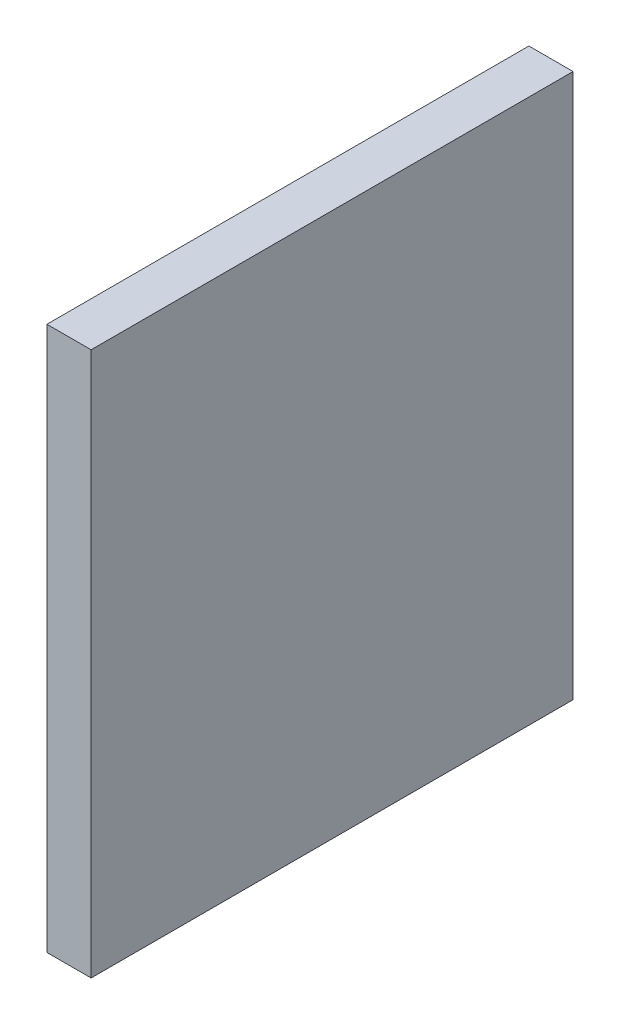
ISO-10303-21;
HEADER;
FILE_DESCRIPTION(('STEP AP214'),'2;1');
FILE_NAME('part.step','',(''),(''),'','','');
FILE_SCHEMA(('AUTOMOTIVE_DESIGN { 1 0 10303 214 1 1 1 1 }'));
ENDSEC;
DATA;
#1=APPLICATION_CONTEXT('core data for automotive mechanical design processes');
#2=APPLICATION_PROTOCOL_DEFINITION('international standard','automotive_design',2000,#1);
#3=PRODUCT_CONTEXT('',#1,'mechanical');
#4=PRODUCT('Part','Part','',(#3));
#5=PRODUCT_RELATED_PRODUCT_CATEGORY('part','',(#4));
#6=PRODUCT_DEFINITION_FORMATION('','',#4);
#7=PRODUCT_DEFINITION_CONTEXT('part definition',#1,'design');
#8=PRODUCT_DEFINITION('design','',#6,#7);
#9=PRODUCT_DEFINITION_SHAPE('','',#8);
#10=(LENGTH_UNIT() NAMED_UNIT(*) SI_UNIT(.MILLI.,.METRE.));
#11=(NAMED_UNIT(*) PLANE_ANGLE_UNIT() SI_UNIT($,.RADIAN.));
#12=(NAMED_UNIT(*) SI_UNIT($,.STERADIAN.) SOLID_ANGLE_UNIT());
#13=UNCERTAINTY_MEASURE_WITH_UNIT(LENGTH_MEASURE(1.E-05),#10,'distance_accuracy_value','');
#14=(GEOMETRIC_REPRESENTATION_CONTEXT(3) GLOBAL_UNCERTAINTY_ASSIGNED_CONTEXT((#13)) GLOBAL_UNIT_ASSIGNED_CONTEXT((#10,
#11,#12)) REPRESENTATION_CONTEXT('',''));
#15=CARTESIAN_POINT('',(0.,0.,0.));
#16=DIRECTION('',(0.,0.,1.));
#17=DIRECTION('',(1.,0.,0.));
#18=AXIS2_PLACEMENT_3D('',#15,#16,#17);
#19=CARTESIAN_POINT('',(0.2063496,2.54004064,0.));
#20=DIRECTION('',(1.,0.,0.));
#21=DIRECTION('',(0.,0.,-1.));
#22=AXIS2_PLACEMENT_3D('',#19,#20,#21);
#23=PLANE('',#22);
#24=DIRECTION('',(0.,0.,1.));
#25=VECTOR('',#24,1.);
#26=CARTESIAN_POINT('',(0.2063496,-2.53995936,0.));
#27=LINE('',#26,#25);
#28=CARTESIAN_POINT('',(0.2063496,-2.53995936,0.));
#29=VERTEX_POINT('',#28);
#30=CARTESIAN_POINT('',(0.2063496,-2.53995936,4.50000116));
#31=VERTEX_POINT('',#30);
#32=EDGE_CURVE('E20',#29,#31,#27,.T.);
#33=ORIENTED_EDGE('',*,*,#32,.F.);
#34=DIRECTION('',(0.,1.,0.));
#35=VECTOR('',#34,1.);
#36=CARTESIAN_POINT('',(0.2063496,-2.54004064,0.));
#37=LINE('',#36,#35);
#38=CARTESIAN_POINT('',(0.2063496,2.54004064,0.));
#39=VERTEX_POINT('',#38);
#40=EDGE_CURVE('E80',#29,#39,#37,.T.);
#41=ORIENTED_EDGE('',*,*,#40,.T.);
#42=DIRECTION('',(0.,0.,1.));
#43=VECTOR('',#42,1.);
#44=CARTESIAN_POINT('',(0.2063496,2.54004063999999,0.));
#45=LINE('',#44,#43);
#46=CARTESIAN_POINT('',(0.2063496,2.54004064,4.50000116));
#47=VERTEX_POINT('',#46);
#48=EDGE_CURVE('E68',#47,#39,#45,.F.);
#49=ORIENTED_EDGE('',*,*,#48,.F.);
#50=DIRECTION('',(0.,1.,0.));
#51=VECTOR('',#50,1.);
#52=CARTESIAN_POINT('',(0.2063496,-2.54004064,4.50000116));
#53=LINE('',#52,#51);
#54=EDGE_CURVE('E56',#31,#47,#53,.T.);
#55=ORIENTED_EDGE('',*,*,#54,.F.);
#56=EDGE_LOOP('',(#33,#41,#49,#55));
#57=FACE_BOUND('',#56,.T.);
#58=ADVANCED_FACE('F17',(#57),#23,.T.);
#59=CARTESIAN_POINT('',(0.2063496,-2.53995936,0.));
#60=DIRECTION('',(0.000196947312815876,-0.999999980605878,0.));
#61=DIRECTION('',(0.999999980605878,0.000196947312815876,0.));
#62=AXIS2_PLACEMENT_3D('',#59,#60,#61);
#63=PLANE('',#62);
#64=DIRECTION('',(0.,0.,1.));
#65=VECTOR('',#64,1.);
#66=CARTESIAN_POINT('',(-0.2063496,-2.54004064,0.));
#67=LINE('',#66,#65);
#68=CARTESIAN_POINT('',(-0.2063496,-2.54004064000001,0.));
#69=VERTEX_POINT('',#68);
#70=CARTESIAN_POINT('',(-0.2063496,-2.54004064000001,4.50000116));
#71=VERTEX_POINT('',#70);
#72=EDGE_CURVE('E83',#69,#71,#67,.T.);
#73=ORIENTED_EDGE('',*,*,#72,.F.);
#74=DIRECTION('',(0.999999980605878,0.000196947312772257,0.));
#75=VECTOR('',#74,1.);
#76=CARTESIAN_POINT('',(-0.2063496,-2.54004064,0.));
#77=LINE('',#76,#75);
#78=EDGE_CURVE('E65',#69,#29,#77,.T.);
#79=ORIENTED_EDGE('',*,*,#78,.T.);
#80=ORIENTED_EDGE('',*,*,#32,.T.);
#81=DIRECTION('',(0.999999980605878,0.000196947312772257,0.));
#82=VECTOR('',#81,1.);
#83=CARTESIAN_POINT('',(-0.2063496,-2.54004064,4.50000116));
#84=LINE('',#83,#82);
#85=EDGE_CURVE('E62',#71,#31,#84,.T.);
#86=ORIENTED_EDGE('',*,*,#85,.F.);
#87=EDGE_LOOP('',(#73,#79,#80,#86));
#88=FACE_BOUND('',#87,.T.);
#89=ADVANCED_FACE('F61',(#88),#63,.T.);
#90=CARTESIAN_POINT('',(-0.2063496,-2.54004064,4.50000116));
#91=DIRECTION('',(0.,0.,1.));
#92=DIRECTION('',(1.,0.,0.));
#93=AXIS2_PLACEMENT_3D('',#90,#91,#92);
#94=PLANE('',#93);
#95=DIRECTION('',(-0.999999980605878,-0.000196947312746976,0.));
#96=VECTOR('',#95,1.);
#97=CARTESIAN_POINT('',(-0.2063496,2.53995936,4.50000116));
#98=LINE('',#97,#96);
#99=CARTESIAN_POINT('',(-0.2063496,2.53995936,4.50000116));
#100=VERTEX_POINT('',#99);
#101=EDGE_CURVE('E70',#100,#47,#98,.F.);
#102=ORIENTED_EDGE('',*,*,#101,.F.);
#103=DIRECTION('',(0.,1.,0.));
#104=VECTOR('',#103,1.);
#105=CARTESIAN_POINT('',(-0.2063496,-2.54004064,4.50000116));
#106=LINE('',#105,#104);
#107=EDGE_CURVE('E74',#71,#100,#106,.T.);
#108=ORIENTED_EDGE('',*,*,#107,.F.);
#109=ORIENTED_EDGE('',*,*,#85,.T.);
#110=ORIENTED_EDGE('',*,*,#54,.T.);
#111=EDGE_LOOP('',(#102,#108,#109,#110));
#112=FACE_BOUND('',#111,.T.);
#113=ADVANCED_FACE('F72',(#112),#94,.T.);
#114=CARTESIAN_POINT('',(-0.2063496,2.53995936,0.));
#115=DIRECTION('',(-0.000196947312746976,0.999999980605878,0.));
#116=DIRECTION('',(-0.999999980605878,-0.000196947312746976,0.));
#117=AXIS2_PLACEMENT_3D('',#114,#115,#116);
#118=PLANE('',#117);
#119=ORIENTED_EDGE('',*,*,#48,.T.);
#120=DIRECTION('',(-0.999999980605878,-0.000196947312772257,0.));
#121=VECTOR('',#120,1.);
#122=CARTESIAN_POINT('',(0.2063496,2.54004064,0.));
#123=LINE('',#122,#121);
#124=CARTESIAN_POINT('',(-0.2063496,2.53995936,0.));
#125=VERTEX_POINT('',#124);
#126=EDGE_CURVE('E35',#39,#125,#123,.T.);
#127=ORIENTED_EDGE('',*,*,#126,.T.);
#128=DIRECTION('',(0.,0.,1.));
#129=VECTOR('',#128,1.);
#130=CARTESIAN_POINT('',(-0.2063496,2.53995936,0.));
#131=LINE('',#130,#129);
#132=EDGE_CURVE('E26',#100,#125,#131,.F.);
#133=ORIENTED_EDGE('',*,*,#132,.F.);
#134=ORIENTED_EDGE('',*,*,#101,.T.);
#135=EDGE_LOOP('',(#119,#127,#133,#134));
#136=FACE_BOUND('',#135,.T.);
#137=ADVANCED_FACE('F89',(#136),#118,.T.);
#138=CARTESIAN_POINT('',(-0.2063496,-2.54004064,0.));
#139=DIRECTION('',(0.,0.,1.));
#140=DIRECTION('',(1.,0.,0.));
#141=AXIS2_PLACEMENT_3D('',#138,#139,#140);
#142=PLANE('',#141);
#143=ORIENTED_EDGE('',*,*,#126,.F.);
#144=ORIENTED_EDGE('',*,*,#40,.F.);
#145=ORIENTED_EDGE('',*,*,#78,.F.);
#146=DIRECTION('',(0.,1.,0.));
#147=VECTOR('',#146,1.);
#148=CARTESIAN_POINT('',(-0.2063496,-2.54004064,0.));
#149=LINE('',#148,#147);
#150=EDGE_CURVE('E11',#125,#69,#149,.F.);
#151=ORIENTED_EDGE('',*,*,#150,.F.);
#152=EDGE_LOOP('',(#143,#144,#145,#151));
#153=FACE_BOUND('',#152,.T.);
#154=ADVANCED_FACE('F91',(#153),#142,.F.);
#155=CARTESIAN_POINT('',(-0.2063496,-2.54004064,0.));
#156=DIRECTION('',(-1.,0.,0.));
#157=DIRECTION('',(0.,0.,1.));
#158=AXIS2_PLACEMENT_3D('',#155,#156,#157);
#159=PLANE('',#158);
#160=ORIENTED_EDGE('',*,*,#132,.T.);
#161=ORIENTED_EDGE('',*,*,#150,.T.);
#162=ORIENTED_EDGE('',*,*,#72,.T.);
#163=ORIENTED_EDGE('',*,*,#107,.T.);
#164=EDGE_LOOP('',(#160,#161,#162,#163));
#165=FACE_BOUND('',#164,.T.);
#166=ADVANCED_FACE('F88',(#165),#159,.T.);
#167=CLOSED_SHELL('',(#58,#89,#113,#137,#154,#166));
#168=MANIFOLD_SOLID_BREP('B1',#167);
#169=ADVANCED_BREP_SHAPE_REPRESENTATION('',(#18,#168),#14);
#170=SHAPE_DEFINITION_REPRESENTATION(#9,#169);
ENDSEC;
END-ISO-10303-21;
